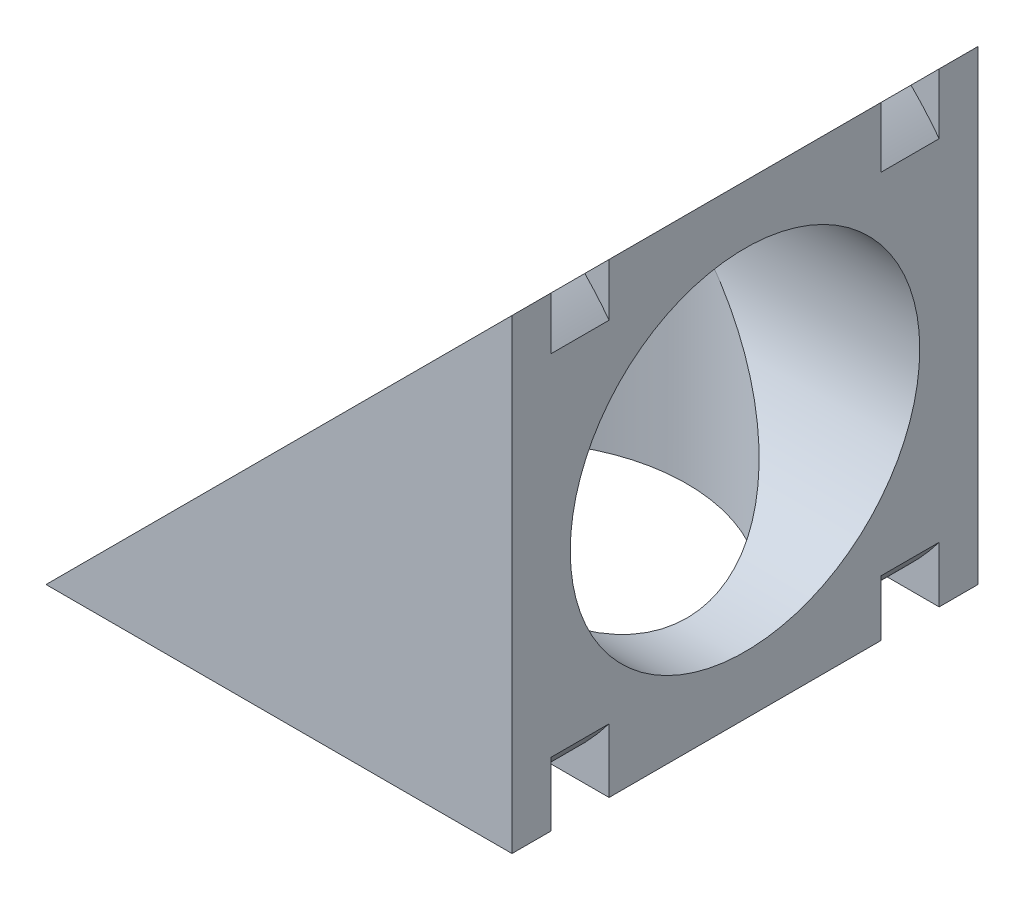
ISO-10303-21;
HEADER;
FILE_DESCRIPTION(('STEP AP214'),'2;1');
FILE_NAME('part.step','',(''),(''),'','','');
FILE_SCHEMA(('AUTOMOTIVE_DESIGN { 1 0 10303 214 1 1 1 1 }'));
ENDSEC;
DATA;
#1=APPLICATION_CONTEXT('core data for automotive mechanical design processes');
#2=APPLICATION_PROTOCOL_DEFINITION('international standard','automotive_design',2000,#1);
#3=PRODUCT_CONTEXT('',#1,'mechanical');
#4=PRODUCT('Part','Part','',(#3));
#5=PRODUCT_RELATED_PRODUCT_CATEGORY('part','',(#4));
#6=PRODUCT_DEFINITION_FORMATION('','',#4);
#7=PRODUCT_DEFINITION_CONTEXT('part definition',#1,'design');
#8=PRODUCT_DEFINITION('design','',#6,#7);
#9=PRODUCT_DEFINITION_SHAPE('','',#8);
#10=(LENGTH_UNIT() NAMED_UNIT(*) SI_UNIT(.MILLI.,.METRE.));
#11=(NAMED_UNIT(*) PLANE_ANGLE_UNIT() SI_UNIT($,.RADIAN.));
#12=(NAMED_UNIT(*) SI_UNIT($,.STERADIAN.) SOLID_ANGLE_UNIT());
#13=UNCERTAINTY_MEASURE_WITH_UNIT(LENGTH_MEASURE(1.E-05),#10,'distance_accuracy_value','');
#14=(GEOMETRIC_REPRESENTATION_CONTEXT(3) GLOBAL_UNCERTAINTY_ASSIGNED_CONTEXT((#13)) GLOBAL_UNIT_ASSIGNED_CONTEXT((#10,
#11,#12)) REPRESENTATION_CONTEXT('',''));
#15=CARTESIAN_POINT('',(0.,0.,0.));
#16=DIRECTION('',(0.,0.,1.));
#17=DIRECTION('',(1.,0.,0.));
#18=AXIS2_PLACEMENT_3D('',#15,#16,#17);
#19=CARTESIAN_POINT('',(0.,30.,0.));
#20=DIRECTION('',(0.,-1.,0.));
#21=DIRECTION('',(0.,0.,-1.));
#22=AXIS2_PLACEMENT_3D('',#19,#20,#21);
#23=CYLINDRICAL_SURFACE('',#22,9.);
#24=CARTESIAN_POINT('',(0.,0.,0.));
#25=DIRECTION('',(0.,1.,0.));
#26=DIRECTION('',(0.,0.,1.));
#27=AXIS2_PLACEMENT_3D('',#24,#25,#26);
#28=CIRCLE('',#27,9.);
#29=CARTESIAN_POINT('',(0.,0.,9.));
#30=VERTEX_POINT('',#29);
#31=EDGE_CURVE('E472',#30,#30,#28,.T.);
#32=ORIENTED_EDGE('',*,*,#31,.F.);
#33=EDGE_LOOP('',(#32));
#34=FACE_BOUND('',#33,.T.);
#35=CARTESIAN_POINT('',(0.,10.9393398282202,0.));
#36=DIRECTION('',(0.707106781186548,-0.707106781186548,0.));
#37=DIRECTION('',(-0.707106781186548,-0.707106781186548,0.));
#38=AXIS2_PLACEMENT_3D('',#35,#36,#37);
#39=ELLIPSE('',#38,12.7279220613579,9.);
#40=CARTESIAN_POINT('',(-6.22253967444163,4.71680015377856,6.50230728280353));
#41=VERTEX_POINT('',#40);
#42=CARTESIAN_POINT('',(0.530330085889903,11.4696699141101,8.9843614130332));
#43=VERTEX_POINT('',#42);
#44=EDGE_CURVE('E43',#41,#43,#39,.F.);
#45=ORIENTED_EDGE('',*,*,#44,.T.);
#46=CARTESIAN_POINT('',(0.,12.,0.));
#47=DIRECTION('',(-0.707106781186547,-0.707106781186547,0.));
#48=DIRECTION('',(0.707106781186547,-0.707106781186547,0.));
#49=AXIS2_PLACEMENT_3D('',#46,#47,#48);
#50=ELLIPSE('',#49,12.7279220613579,9.);
#51=CARTESIAN_POINT('',(0.530330085889778,11.46966991411,-8.98436141303321));
#52=VERTEX_POINT('',#51);
#53=EDGE_CURVE('E11',#43,#52,#50,.F.);
#54=ORIENTED_EDGE('',*,*,#53,.T.);
#55=CARTESIAN_POINT('',(-6.22253967444163,4.71680015377856,-6.50230728280353));
#56=VERTEX_POINT('',#55);
#57=EDGE_CURVE('E334',#52,#56,#39,.F.);
#58=ORIENTED_EDGE('',*,*,#57,.T.);
#59=CARTESIAN_POINT('',(0.,-1.50573952066307,0.));
#60=DIRECTION('',(-0.707106781186547,-0.707106781186547,0.));
#61=DIRECTION('',(0.707106781186548,-0.707106781186548,0.));
#62=AXIS2_PLACEMENT_3D('',#59,#60,#61);
#63=ELLIPSE('',#62,12.7279220613579,9.);
#64=CARTESIAN_POINT('',(-6.75286976033154,5.24713023966847,-5.94968486560421));
#65=VERTEX_POINT('',#64);
#66=EDGE_CURVE('E470',#56,#65,#63,.F.);
#67=ORIENTED_EDGE('',*,*,#66,.T.);
#68=CARTESIAN_POINT('',(0.,12.,0.));
#69=DIRECTION('',(-0.707106781186547,0.707106781186548,0.));
#70=DIRECTION('',(-0.707106781186548,-0.707106781186547,0.));
#71=AXIS2_PLACEMENT_3D('',#68,#69,#70);
#72=ELLIPSE('',#71,12.7279220613579,9.);
#73=CARTESIAN_POINT('',(-6.75286976033154,5.24713023966847,5.94968486560421));
#74=VERTEX_POINT('',#73);
#75=EDGE_CURVE('E244',#74,#65,#72,.F.);
#76=ORIENTED_EDGE('',*,*,#75,.F.);
#77=EDGE_CURVE('E243',#74,#41,#63,.F.);
#78=ORIENTED_EDGE('',*,*,#77,.T.);
#79=EDGE_LOOP('',(#45,#54,#58,#67,#76,#78));
#80=FACE_BOUND('',#79,.T.);
#81=ADVANCED_FACE('F35',(#34,#80),#23,.F.);
#82=CARTESIAN_POINT('',(-6.22253967444163,4.71680015377856,-9.55000000000001));
#83=DIRECTION('',(-0.707106781186547,-0.707106781186547,0.));
#84=DIRECTION('',(0.707106781186548,-0.707106781186548,0.));
#85=AXIS2_PLACEMENT_3D('',#82,#83,#84);
#86=PLANE('',#85);
#87=ORIENTED_EDGE('',*,*,#66,.F.);
#88=DIRECTION('',(0.,0.,1.));
#89=VECTOR('',#88,1.);
#90=CARTESIAN_POINT('',(-6.22253967444163,4.71680015377856,-9.55000000000001));
#91=LINE('',#90,#89);
#92=CARTESIAN_POINT('',(-6.22253967444163,4.71680015377856,-9.55000000000001));
#93=VERTEX_POINT('',#92);
#94=EDGE_CURVE('E412',#93,#56,#91,.T.);
#95=ORIENTED_EDGE('',*,*,#94,.F.);
#96=DIRECTION('',(-0.707106781186547,0.707106781186547,0.));
#97=VECTOR('',#96,1.);
#98=CARTESIAN_POINT('',(-6.22253967444163,4.71680015377856,-9.55000000000001));
#99=LINE('',#98,#97);
#100=CARTESIAN_POINT('',(-6.75286976033154,5.24713023966847,-9.55000000000001));
#101=VERTEX_POINT('',#100);
#102=EDGE_CURVE('E270',#93,#101,#99,.T.);
#103=ORIENTED_EDGE('',*,*,#102,.T.);
#104=DIRECTION('',(0.,0.,1.));
#105=VECTOR('',#104,1.);
#106=CARTESIAN_POINT('',(-6.75286976033154,5.24713023966847,-9.55000000000001));
#107=LINE('',#106,#105);
#108=EDGE_CURVE('E264',#101,#65,#107,.T.);
#109=ORIENTED_EDGE('',*,*,#108,.T.);
#110=EDGE_LOOP('',(#87,#95,#103,#109));
#111=FACE_BOUND('',#110,.T.);
#112=ADVANCED_FACE('F487',(#111),#86,.F.);
#113=CARTESIAN_POINT('',(7.28319984622143,18.2225396744416,-9.55000000000001));
#114=DIRECTION('',(0.707106781186547,0.707106781186547,0.));
#115=DIRECTION('',(-0.707106781186548,0.707106781186548,0.));
#116=AXIS2_PLACEMENT_3D('',#113,#114,#115);
#117=PLANE('',#116);
#118=CARTESIAN_POINT('',(13.505739520663,12.,0.));
#119=DIRECTION('',(0.707106781186547,0.707106781186547,0.));
#120=DIRECTION('',(-0.707106781186548,0.707106781186548,0.));
#121=AXIS2_PLACEMENT_3D('',#118,#119,#120);
#122=ELLIPSE('',#121,12.7279220613579,9.);
#123=CARTESIAN_POINT('',(7.28319984622143,18.2225396744416,6.50230728280353));
#124=VERTEX_POINT('',#123);
#125=CARTESIAN_POINT('',(6.75286976033152,18.7528697603315,5.94968486560423));
#126=VERTEX_POINT('',#125);
#127=EDGE_CURVE('E238',#124,#126,#122,.F.);
#128=ORIENTED_EDGE('',*,*,#127,.F.);
#129=DIRECTION('',(0.,0.,-1.));
#130=VECTOR('',#129,1.);
#131=CARTESIAN_POINT('',(7.28319984622143,18.2225396744416,-9.55000000000001));
#132=LINE('',#131,#130);
#133=CARTESIAN_POINT('',(7.28319984622143,18.2225396744416,9.54999999999999));
#134=VERTEX_POINT('',#133);
#135=EDGE_CURVE('E418',#134,#124,#132,.T.);
#136=ORIENTED_EDGE('',*,*,#135,.F.);
#137=DIRECTION('',(-0.707106781186547,0.707106781186547,0.));
#138=VECTOR('',#137,1.);
#139=CARTESIAN_POINT('',(7.28319984622143,18.2225396744416,9.54999999999999));
#140=LINE('',#139,#138);
#141=CARTESIAN_POINT('',(6.75286976033152,18.7528697603315,9.54999999999999));
#142=VERTEX_POINT('',#141);
#143=EDGE_CURVE('E275',#134,#142,#140,.T.);
#144=ORIENTED_EDGE('',*,*,#143,.T.);
#145=DIRECTION('',(0.,0.,-1.));
#146=VECTOR('',#145,1.);
#147=CARTESIAN_POINT('',(6.75286976033152,18.7528697603315,-9.55000000000001));
#148=LINE('',#147,#146);
#149=EDGE_CURVE('E260',#142,#126,#148,.T.);
#150=ORIENTED_EDGE('',*,*,#149,.T.);
#151=EDGE_LOOP('',(#128,#136,#144,#150));
#152=FACE_BOUND('',#151,.T.);
#153=ADVANCED_FACE('F498',(#152),#117,.F.);
#154=CARTESIAN_POINT('',(-5.46966991411009,5.46966991411009,0.));
#155=DIRECTION('',(0.707106781186548,-0.707106781186548,0.));
#156=DIRECTION('',(0.707106781186548,0.707106781186548,0.));
#157=AXIS2_PLACEMENT_3D('',#154,#155,#156);
#158=PLANE('',#157);
#159=CARTESIAN_POINT('',(1.0606601717798,12.,0.));
#160=DIRECTION('',(0.707106781186548,-0.707106781186548,0.));
#161=DIRECTION('',(-0.707106781186548,-0.707106781186548,0.));
#162=AXIS2_PLACEMENT_3D('',#159,#160,#161);
#163=ELLIPSE('',#162,12.7279220613579,9.);
#164=EDGE_CURVE('E479',#43,#124,#163,.F.);
#165=ORIENTED_EDGE('',*,*,#164,.F.);
#166=ORIENTED_EDGE('',*,*,#44,.F.);
#167=CARTESIAN_POINT('',(-6.22253967444163,4.71680015377856,9.54999999999999));
#168=VERTEX_POINT('',#167);
#169=EDGE_CURVE('E269',#41,#168,#91,.T.);
#170=ORIENTED_EDGE('',*,*,#169,.T.);
#171=DIRECTION('',(0.707106781186548,0.707106781186548,0.));
#172=VECTOR('',#171,1.);
#173=CARTESIAN_POINT('',(7.28319984622143,18.2225396744416,9.54999999999999));
#174=LINE('',#173,#172);
#175=EDGE_CURVE('E415',#168,#134,#174,.T.);
#176=ORIENTED_EDGE('',*,*,#175,.T.);
#177=ORIENTED_EDGE('',*,*,#135,.T.);
#178=EDGE_LOOP('',(#165,#166,#170,#176,#177));
#179=FACE_BOUND('',#178,.T.);
#180=ADVANCED_FACE('F496',(#179),#158,.F.);
#181=CARTESIAN_POINT('',(12.,24.,-12.));
#182=DIRECTION('',(-1.,0.,0.));
#183=DIRECTION('',(0.,0.,1.));
#184=AXIS2_PLACEMENT_3D('',#181,#182,#183);
#185=PLANE('',#184);
#186=CARTESIAN_POINT('',(12.,12.,0.));
#187=DIRECTION('',(-1.,0.,0.));
#188=DIRECTION('',(0.,0.,1.));
#189=AXIS2_PLACEMENT_3D('',#186,#187,#188);
#190=CIRCLE('',#189,9.);
#191=CARTESIAN_POINT('',(12.,12.,8.99999999999999));
#192=VERTEX_POINT('',#191);
#193=EDGE_CURVE('E475',#192,#192,#190,.F.);
#194=ORIENTED_EDGE('',*,*,#193,.F.);
#195=EDGE_LOOP('',(#194));
#196=FACE_BOUND('',#195,.T.);
#197=DIRECTION('',(0.,0.,-1.));
#198=VECTOR('',#197,1.);
#199=CARTESIAN_POINT('',(12.,20.8850102409347,-7.));
#200=LINE('',#199,#198);
#201=CARTESIAN_POINT('',(12.,20.8850102409347,-10.));
#202=VERTEX_POINT('',#201);
#203=CARTESIAN_POINT('',(12.,20.8850102409347,-7.));
#204=VERTEX_POINT('',#203);
#205=EDGE_CURVE('E361',#202,#204,#200,.F.);
#206=ORIENTED_EDGE('',*,*,#205,.T.);
#207=DIRECTION('',(0.,1.,0.));
#208=VECTOR('',#207,1.);
#209=CARTESIAN_POINT('',(12.,24.,-7.));
#210=LINE('',#209,#208);
#211=CARTESIAN_POINT('',(12.,24.,-7.));
#212=VERTEX_POINT('',#211);
#213=EDGE_CURVE('E360',#204,#212,#210,.T.);
#214=ORIENTED_EDGE('',*,*,#213,.T.);
#215=DIRECTION('',(0.,0.,-1.));
#216=VECTOR('',#215,1.);
#217=CARTESIAN_POINT('',(12.,24.,-12.));
#218=LINE('',#217,#216);
#219=CARTESIAN_POINT('',(12.,24.,7.));
#220=VERTEX_POINT('',#219);
#221=EDGE_CURVE('E289',#220,#212,#218,.T.);
#222=ORIENTED_EDGE('',*,*,#221,.F.);
#223=DIRECTION('',(0.,1.,0.));
#224=VECTOR('',#223,1.);
#225=CARTESIAN_POINT('',(12.,24.,7.));
#226=LINE('',#225,#224);
#227=CARTESIAN_POINT('',(12.,21.2889293337778,7.));
#228=VERTEX_POINT('',#227);
#229=EDGE_CURVE('E359',#228,#220,#226,.T.);
#230=ORIENTED_EDGE('',*,*,#229,.F.);
#231=DIRECTION('',(0.,0.,1.));
#232=VECTOR('',#231,1.);
#233=CARTESIAN_POINT('',(12.,21.2889293337778,7.));
#234=LINE('',#233,#232);
#235=CARTESIAN_POINT('',(12.,21.2889293337778,10.));
#236=VERTEX_POINT('',#235);
#237=EDGE_CURVE('E395',#236,#228,#234,.F.);
#238=ORIENTED_EDGE('',*,*,#237,.F.);
#239=DIRECTION('',(0.,1.,0.));
#240=VECTOR('',#239,1.);
#241=CARTESIAN_POINT('',(12.,24.,10.));
#242=LINE('',#241,#240);
#243=CARTESIAN_POINT('',(12.,24.,10.));
#244=VERTEX_POINT('',#243);
#245=EDGE_CURVE('E399',#236,#244,#242,.T.);
#246=ORIENTED_EDGE('',*,*,#245,.T.);
#247=CARTESIAN_POINT('',(12.,24.,12.));
#248=VERTEX_POINT('',#247);
#249=EDGE_CURVE('E285',#248,#244,#218,.T.);
#250=ORIENTED_EDGE('',*,*,#249,.F.);
#251=DIRECTION('',(0.,-1.,0.));
#252=VECTOR('',#251,1.);
#253=CARTESIAN_POINT('',(12.,24.,12.));
#254=LINE('',#253,#252);
#255=CARTESIAN_POINT('',(12.,0.,12.));
#256=VERTEX_POINT('',#255);
#257=EDGE_CURVE('E288',#248,#256,#254,.T.);
#258=ORIENTED_EDGE('',*,*,#257,.T.);
#259=DIRECTION('',(0.,0.,-1.));
#260=VECTOR('',#259,1.);
#261=CARTESIAN_POINT('',(12.,0.,-12.));
#262=LINE('',#261,#260);
#263=CARTESIAN_POINT('',(12.,0.,10.));
#264=VERTEX_POINT('',#263);
#265=EDGE_CURVE('E291',#256,#264,#262,.T.);
#266=ORIENTED_EDGE('',*,*,#265,.T.);
#267=CARTESIAN_POINT('',(12.,3.28892933377779,10.));
#268=VERTEX_POINT('',#267);
#269=EDGE_CURVE('E403',#264,#268,#242,.T.);
#270=ORIENTED_EDGE('',*,*,#269,.T.);
#271=DIRECTION('',(0.,0.,1.));
#272=VECTOR('',#271,1.);
#273=CARTESIAN_POINT('',(12.,3.28892933377779,7.));
#274=LINE('',#273,#272);
#275=CARTESIAN_POINT('',(12.,3.28892933377779,7.));
#276=VERTEX_POINT('',#275);
#277=EDGE_CURVE('E397',#276,#268,#274,.T.);
#278=ORIENTED_EDGE('',*,*,#277,.F.);
#279=CARTESIAN_POINT('',(12.,0.,7.));
#280=VERTEX_POINT('',#279);
#281=EDGE_CURVE('E409',#280,#276,#226,.T.);
#282=ORIENTED_EDGE('',*,*,#281,.F.);
#283=CARTESIAN_POINT('',(12.,0.,-7.));
#284=VERTEX_POINT('',#283);
#285=EDGE_CURVE('E295',#280,#284,#262,.T.);
#286=ORIENTED_EDGE('',*,*,#285,.T.);
#287=CARTESIAN_POINT('',(12.,2.88501024093469,-7.));
#288=VERTEX_POINT('',#287);
#289=EDGE_CURVE('E366',#284,#288,#210,.T.);
#290=ORIENTED_EDGE('',*,*,#289,.T.);
#291=DIRECTION('',(0.,0.,-1.));
#292=VECTOR('',#291,1.);
#293=CARTESIAN_POINT('',(12.,2.88501024093469,-7.));
#294=LINE('',#293,#292);
#295=CARTESIAN_POINT('',(12.,2.88501024093469,-10.));
#296=VERTEX_POINT('',#295);
#297=EDGE_CURVE('E459',#288,#296,#294,.T.);
#298=ORIENTED_EDGE('',*,*,#297,.T.);
#299=DIRECTION('',(0.,1.,0.));
#300=VECTOR('',#299,1.);
#301=CARTESIAN_POINT('',(12.,24.,-10.));
#302=LINE('',#301,#300);
#303=CARTESIAN_POINT('',(12.,0.,-10.));
#304=VERTEX_POINT('',#303);
#305=EDGE_CURVE('E364',#304,#296,#302,.T.);
#306=ORIENTED_EDGE('',*,*,#305,.F.);
#307=CARTESIAN_POINT('',(12.,0.,-12.));
#308=VERTEX_POINT('',#307);
#309=EDGE_CURVE('E284',#304,#308,#262,.T.);
#310=ORIENTED_EDGE('',*,*,#309,.T.);
#311=DIRECTION('',(0.,-1.,0.));
#312=VECTOR('',#311,1.);
#313=CARTESIAN_POINT('',(12.,24.,-12.));
#314=LINE('',#313,#312);
#315=CARTESIAN_POINT('',(12.,24.,-12.));
#316=VERTEX_POINT('',#315);
#317=EDGE_CURVE('E307',#316,#308,#314,.T.);
#318=ORIENTED_EDGE('',*,*,#317,.F.);
#319=CARTESIAN_POINT('',(12.,24.,-10.));
#320=VERTEX_POINT('',#319);
#321=EDGE_CURVE('E290',#320,#316,#218,.T.);
#322=ORIENTED_EDGE('',*,*,#321,.F.);
#323=EDGE_CURVE('E353',#202,#320,#302,.T.);
#324=ORIENTED_EDGE('',*,*,#323,.F.);
#325=EDGE_LOOP('',(#206,#214,#222,#230,#238,#246,#250,#258,#266,#270,#278,#282,#286,#290,#298,
#306,#310,#318,#322,#324));
#326=FACE_BOUND('',#325,.T.);
#327=ADVANCED_FACE('F37',(#196,#326),#185,.F.);
#328=CARTESIAN_POINT('',(0.,0.,0.));
#329=DIRECTION('',(0.,1.,0.));
#330=DIRECTION('',(0.,0.,1.));
#331=AXIS2_PLACEMENT_3D('',#328,#329,#330);
#332=PLANE('',#331);
#333=ORIENTED_EDGE('',*,*,#31,.T.);
#334=EDGE_LOOP('',(#333));
#335=FACE_BOUND('',#334,.T.);
#336=DIRECTION('',(0.,0.,-1.));
#337=VECTOR('',#336,1.);
#338=CARTESIAN_POINT('',(9.15131310648245,0.,-7.));
#339=LINE('',#338,#337);
#340=CARTESIAN_POINT('',(9.15131310648245,0.,-10.));
#341=VERTEX_POINT('',#340);
#342=CARTESIAN_POINT('',(9.15131310648245,0.,-7.));
#343=VERTEX_POINT('',#342);
#344=EDGE_CURVE('E461',#341,#343,#339,.F.);
#345=ORIENTED_EDGE('',*,*,#344,.T.);
#346=DIRECTION('',(1.,0.,0.));
#347=VECTOR('',#346,1.);
#348=CARTESIAN_POINT('',(0.,0.,-7.));
#349=LINE('',#348,#347);
#350=EDGE_CURVE('E368',#343,#284,#349,.T.);
#351=ORIENTED_EDGE('',*,*,#350,.T.);
#352=ORIENTED_EDGE('',*,*,#285,.F.);
#353=DIRECTION('',(1.,0.,0.));
#354=VECTOR('',#353,1.);
#355=CARTESIAN_POINT('',(0.,0.,7.));
#356=LINE('',#355,#354);
#357=CARTESIAN_POINT('',(8.601291521011,0.,7.));
#358=VERTEX_POINT('',#357);
#359=EDGE_CURVE('E411',#358,#280,#356,.T.);
#360=ORIENTED_EDGE('',*,*,#359,.F.);
#361=DIRECTION('',(0.,0.,1.));
#362=VECTOR('',#361,1.);
#363=CARTESIAN_POINT('',(8.601291521011,0.,7.));
#364=LINE('',#363,#362);
#365=CARTESIAN_POINT('',(8.601291521011,0.,10.));
#366=VERTEX_POINT('',#365);
#367=EDGE_CURVE('E387',#366,#358,#364,.F.);
#368=ORIENTED_EDGE('',*,*,#367,.F.);
#369=DIRECTION('',(1.,0.,0.));
#370=VECTOR('',#369,1.);
#371=CARTESIAN_POINT('',(0.,0.,10.));
#372=LINE('',#371,#370);
#373=EDGE_CURVE('E406',#366,#264,#372,.T.);
#374=ORIENTED_EDGE('',*,*,#373,.T.);
#375=ORIENTED_EDGE('',*,*,#265,.F.);
#376=DIRECTION('',(1.,0.,0.));
#377=VECTOR('',#376,1.);
#378=CARTESIAN_POINT('',(-12.,0.,12.));
#379=LINE('',#378,#377);
#380=CARTESIAN_POINT('',(-12.,0.,12.));
#381=VERTEX_POINT('',#380);
#382=EDGE_CURVE('E302',#381,#256,#379,.T.);
#383=ORIENTED_EDGE('',*,*,#382,.F.);
#384=DIRECTION('',(0.,0.,1.));
#385=VECTOR('',#384,1.);
#386=CARTESIAN_POINT('',(-12.,0.,-12.));
#387=LINE('',#386,#385);
#388=CARTESIAN_POINT('',(-12.,0.,10.));
#389=VERTEX_POINT('',#388);
#390=EDGE_CURVE('E298',#389,#381,#387,.T.);
#391=ORIENTED_EDGE('',*,*,#390,.F.);
#392=CARTESIAN_POINT('',(-8.601291521011,0.,10.));
#393=VERTEX_POINT('',#392);
#394=EDGE_CURVE('E402',#389,#393,#372,.T.);
#395=ORIENTED_EDGE('',*,*,#394,.T.);
#396=DIRECTION('',(0.,0.,1.));
#397=VECTOR('',#396,1.);
#398=CARTESIAN_POINT('',(-8.601291521011,0.,7.));
#399=LINE('',#398,#397);
#400=CARTESIAN_POINT('',(-8.601291521011,0.,7.));
#401=VERTEX_POINT('',#400);
#402=EDGE_CURVE('E393',#401,#393,#399,.T.);
#403=ORIENTED_EDGE('',*,*,#402,.F.);
#404=CARTESIAN_POINT('',(-12.,0.,7.));
#405=VERTEX_POINT('',#404);
#406=EDGE_CURVE('E408',#405,#401,#356,.T.);
#407=ORIENTED_EDGE('',*,*,#406,.F.);
#408=CARTESIAN_POINT('',(-12.,0.,-7.));
#409=VERTEX_POINT('',#408);
#410=EDGE_CURVE('E303',#409,#405,#387,.T.);
#411=ORIENTED_EDGE('',*,*,#410,.F.);
#412=CARTESIAN_POINT('',(-9.15131310648245,0.,-7.));
#413=VERTEX_POINT('',#412);
#414=EDGE_CURVE('E363',#409,#413,#349,.T.);
#415=ORIENTED_EDGE('',*,*,#414,.T.);
#416=DIRECTION('',(0.,0.,-1.));
#417=VECTOR('',#416,1.);
#418=CARTESIAN_POINT('',(-9.15131310648245,0.,-7.));
#419=LINE('',#418,#417);
#420=CARTESIAN_POINT('',(-9.15131310648245,0.,-10.));
#421=VERTEX_POINT('',#420);
#422=EDGE_CURVE('E456',#413,#421,#419,.T.);
#423=ORIENTED_EDGE('',*,*,#422,.T.);
#424=DIRECTION('',(1.,0.,0.));
#425=VECTOR('',#424,1.);
#426=CARTESIAN_POINT('',(0.,0.,-10.));
#427=LINE('',#426,#425);
#428=CARTESIAN_POINT('',(-12.,0.,-10.));
#429=VERTEX_POINT('',#428);
#430=EDGE_CURVE('E452',#429,#421,#427,.T.);
#431=ORIENTED_EDGE('',*,*,#430,.F.);
#432=CARTESIAN_POINT('',(-12.,0.,-12.));
#433=VERTEX_POINT('',#432);
#434=EDGE_CURVE('E299',#433,#429,#387,.T.);
#435=ORIENTED_EDGE('',*,*,#434,.F.);
#436=DIRECTION('',(-1.,0.,0.));
#437=VECTOR('',#436,1.);
#438=CARTESIAN_POINT('',(-12.,0.,-12.));
#439=LINE('',#438,#437);
#440=EDGE_CURVE('E294',#308,#433,#439,.T.);
#441=ORIENTED_EDGE('',*,*,#440,.F.);
#442=ORIENTED_EDGE('',*,*,#309,.F.);
#443=EDGE_CURVE('E370',#341,#304,#427,.T.);
#444=ORIENTED_EDGE('',*,*,#443,.F.);
#445=EDGE_LOOP('',(#345,#351,#352,#360,#368,#374,#375,#383,#391,#395,#403,#407,#411,#415,#423,
#431,#435,#441,#442,#444));
#446=FACE_BOUND('',#445,.T.);
#447=ADVANCED_FACE('F438',(#335,#446),#332,.F.);
#448=CARTESIAN_POINT('',(-6.,6.,0.));
#449=DIRECTION('',(-0.707106781186547,0.707106781186548,0.));
#450=DIRECTION('',(-0.707106781186548,-0.707106781186547,0.));
#451=AXIS2_PLACEMENT_3D('',#448,#449,#450);
#452=PLANE('',#451);
#453=DIRECTION('',(0.707106781186548,0.707106781186547,0.));
#454=VECTOR('',#453,1.);
#455=CARTESIAN_POINT('',(-6.,6.,-7.));
#456=LINE('',#455,#454);
#457=CARTESIAN_POINT('',(10.5489510067587,22.5489510067587,-7.));
#458=VERTEX_POINT('',#457);
#459=EDGE_CURVE('E333',#458,#212,#456,.T.);
#460=ORIENTED_EDGE('',*,*,#459,.F.);
#461=DIRECTION('',(0.,0.,-1.));
#462=VECTOR('',#461,1.);
#463=CARTESIAN_POINT('',(10.5489510067587,22.5489510067587,-7.));
#464=LINE('',#463,#462);
#465=CARTESIAN_POINT('',(10.5489510067587,22.5489510067587,-10.));
#466=VERTEX_POINT('',#465);
#467=EDGE_CURVE('E332',#466,#458,#464,.F.);
#468=ORIENTED_EDGE('',*,*,#467,.F.);
#469=DIRECTION('',(0.707106781186548,0.707106781186547,0.));
#470=VECTOR('',#469,1.);
#471=CARTESIAN_POINT('',(-6.,6.,-10.));
#472=LINE('',#471,#470);
#473=EDGE_CURVE('E329',#466,#320,#472,.T.);
#474=ORIENTED_EDGE('',*,*,#473,.T.);
#475=ORIENTED_EDGE('',*,*,#321,.T.);
#476=DIRECTION('',(-0.707106781186548,-0.707106781186547,0.));
#477=VECTOR('',#476,1.);
#478=CARTESIAN_POINT('',(0.,12.,-12.));
#479=LINE('',#478,#477);
#480=EDGE_CURVE('E282',#316,#433,#479,.T.);
#481=ORIENTED_EDGE('',*,*,#480,.T.);
#482=ORIENTED_EDGE('',*,*,#434,.T.);
#483=CARTESIAN_POINT('',(-10.663940765824,1.33605923417596,-10.));
#484=VERTEX_POINT('',#483);
#485=EDGE_CURVE('E325',#429,#484,#472,.T.);
#486=ORIENTED_EDGE('',*,*,#485,.T.);
#487=DIRECTION('',(0.,0.,-1.));
#488=VECTOR('',#487,1.);
#489=CARTESIAN_POINT('',(-10.663940765824,1.33605923417596,-7.));
#490=LINE('',#489,#488);
#491=CARTESIAN_POINT('',(-10.663940765824,1.33605923417596,-7.));
#492=VERTEX_POINT('',#491);
#493=EDGE_CURVE('E323',#492,#484,#490,.T.);
#494=ORIENTED_EDGE('',*,*,#493,.F.);
#495=EDGE_CURVE('E328',#409,#492,#456,.T.);
#496=ORIENTED_EDGE('',*,*,#495,.F.);
#497=ORIENTED_EDGE('',*,*,#410,.T.);
#498=DIRECTION('',(0.707106781186548,0.707106781186547,0.));
#499=VECTOR('',#498,1.);
#500=CARTESIAN_POINT('',(-6.,6.,7.));
#501=LINE('',#500,#499);
#502=CARTESIAN_POINT('',(-10.4611531821579,1.53884681784207,7.));
#503=VERTEX_POINT('',#502);
#504=EDGE_CURVE('E320',#405,#503,#501,.T.);
#505=ORIENTED_EDGE('',*,*,#504,.T.);
#506=DIRECTION('',(0.,0.,1.));
#507=VECTOR('',#506,1.);
#508=CARTESIAN_POINT('',(-10.4611531821579,1.53884681784207,7.));
#509=LINE('',#508,#507);
#510=CARTESIAN_POINT('',(-10.4611531821579,1.53884681784207,10.));
#511=VERTEX_POINT('',#510);
#512=EDGE_CURVE('E319',#503,#511,#509,.T.);
#513=ORIENTED_EDGE('',*,*,#512,.T.);
#514=DIRECTION('',(0.707106781186548,0.707106781186547,0.));
#515=VECTOR('',#514,1.);
#516=CARTESIAN_POINT('',(-6.,6.,10.));
#517=LINE('',#516,#515);
#518=EDGE_CURVE('E316',#389,#511,#517,.T.);
#519=ORIENTED_EDGE('',*,*,#518,.F.);
#520=ORIENTED_EDGE('',*,*,#390,.T.);
#521=DIRECTION('',(0.707106781186548,0.707106781186547,0.));
#522=VECTOR('',#521,1.);
#523=CARTESIAN_POINT('',(0.,12.,12.));
#524=LINE('',#523,#522);
#525=EDGE_CURVE('E272',#381,#248,#524,.T.);
#526=ORIENTED_EDGE('',*,*,#525,.T.);
#527=ORIENTED_EDGE('',*,*,#249,.T.);
#528=CARTESIAN_POINT('',(10.7500825159357,22.7500825159357,10.));
#529=VERTEX_POINT('',#528);
#530=EDGE_CURVE('E313',#529,#244,#517,.T.);
#531=ORIENTED_EDGE('',*,*,#530,.F.);
#532=DIRECTION('',(0.,0.,1.));
#533=VECTOR('',#532,1.);
#534=CARTESIAN_POINT('',(10.7500825159357,22.7500825159357,7.));
#535=LINE('',#534,#533);
#536=CARTESIAN_POINT('',(10.7500825159357,22.7500825159357,7.));
#537=VERTEX_POINT('',#536);
#538=EDGE_CURVE('E310',#529,#537,#535,.F.);
#539=ORIENTED_EDGE('',*,*,#538,.T.);
#540=EDGE_CURVE('E315',#537,#220,#501,.T.);
#541=ORIENTED_EDGE('',*,*,#540,.T.);
#542=ORIENTED_EDGE('',*,*,#221,.T.);
#543=EDGE_LOOP('',(#460,#468,#474,#475,#481,#482,#486,#494,#496,#497,#505,#513,#519,#520,#526,
#527,#531,#539,#541,#542));
#544=FACE_BOUND('',#543,.T.);
#545=CARTESIAN_POINT('',(6.75286976033152,18.7528697603315,-5.94968486560424));
#546=VERTEX_POINT('',#545);
#547=CARTESIAN_POINT('',(6.75286976033152,18.7528697603315,-9.55000000000001));
#548=VERTEX_POINT('',#547);
#549=EDGE_CURVE('E250',#546,#548,#148,.T.);
#550=ORIENTED_EDGE('',*,*,#549,.F.);
#551=EDGE_CURVE('E231',#546,#126,#72,.F.);
#552=ORIENTED_EDGE('',*,*,#551,.T.);
#553=ORIENTED_EDGE('',*,*,#149,.F.);
#554=DIRECTION('',(0.707106781186548,0.707106781186548,0.));
#555=VECTOR('',#554,1.);
#556=CARTESIAN_POINT('',(6.75286976033152,18.7528697603315,9.54999999999999));
#557=LINE('',#556,#555);
#558=CARTESIAN_POINT('',(-6.75286976033154,5.24713023966847,9.54999999999999));
#559=VERTEX_POINT('',#558);
#560=EDGE_CURVE('E261',#559,#142,#557,.T.);
#561=ORIENTED_EDGE('',*,*,#560,.F.);
#562=EDGE_CURVE('E423',#74,#559,#107,.T.);
#563=ORIENTED_EDGE('',*,*,#562,.F.);
#564=ORIENTED_EDGE('',*,*,#75,.T.);
#565=ORIENTED_EDGE('',*,*,#108,.F.);
#566=DIRECTION('',(-0.707106781186547,-0.707106781186547,0.));
#567=VECTOR('',#566,1.);
#568=CARTESIAN_POINT('',(6.75286976033152,18.7528697603315,-9.55000000000001));
#569=LINE('',#568,#567);
#570=EDGE_CURVE('E259',#548,#101,#569,.T.);
#571=ORIENTED_EDGE('',*,*,#570,.F.);
#572=EDGE_LOOP('',(#550,#552,#553,#561,#563,#564,#565,#571));
#573=FACE_BOUND('',#572,.T.);
#574=ADVANCED_FACE('F256',(#544,#573),#452,.T.);
#575=CARTESIAN_POINT('',(-12.,24.,-12.));
#576=DIRECTION('',(0.,0.,1.));
#577=DIRECTION('',(1.,0.,0.));
#578=AXIS2_PLACEMENT_3D('',#575,#576,#577);
#579=PLANE('',#578);
#580=ORIENTED_EDGE('',*,*,#480,.F.);
#581=ORIENTED_EDGE('',*,*,#317,.T.);
#582=ORIENTED_EDGE('',*,*,#440,.T.);
#583=EDGE_LOOP('',(#580,#581,#582));
#584=FACE_BOUND('',#583,.T.);
#585=ADVANCED_FACE('F446',(#584),#579,.F.);
#586=CARTESIAN_POINT('',(-12.,24.,12.));
#587=DIRECTION('',(0.,0.,-1.));
#588=DIRECTION('',(-1.,0.,0.));
#589=AXIS2_PLACEMENT_3D('',#586,#587,#588);
#590=PLANE('',#589);
#591=ORIENTED_EDGE('',*,*,#525,.F.);
#592=ORIENTED_EDGE('',*,*,#382,.T.);
#593=ORIENTED_EDGE('',*,*,#257,.F.);
#594=EDGE_LOOP('',(#591,#592,#593));
#595=FACE_BOUND('',#594,.T.);
#596=ADVANCED_FACE('F556',(#595),#590,.F.);
#597=ORIENTED_EDGE('',*,*,#77,.F.);
#598=ORIENTED_EDGE('',*,*,#562,.T.);
#599=DIRECTION('',(-0.707106781186547,0.707106781186547,0.));
#600=VECTOR('',#599,1.);
#601=CARTESIAN_POINT('',(-6.22253967444163,4.71680015377856,9.54999999999999));
#602=LINE('',#601,#600);
#603=EDGE_CURVE('E277',#168,#559,#602,.T.);
#604=ORIENTED_EDGE('',*,*,#603,.F.);
#605=ORIENTED_EDGE('',*,*,#169,.F.);
#606=EDGE_LOOP('',(#597,#598,#604,#605));
#607=FACE_BOUND('',#606,.T.);
#608=ADVANCED_FACE('F494',(#607),#86,.F.);
#609=CARTESIAN_POINT('',(7.28319984622143,18.2225396744416,-9.55000000000001));
#610=DIRECTION('',(0.,0.,-1.));
#611=DIRECTION('',(-1.,0.,0.));
#612=AXIS2_PLACEMENT_3D('',#609,#610,#611);
#613=PLANE('',#612);
#614=ORIENTED_EDGE('',*,*,#570,.T.);
#615=ORIENTED_EDGE('',*,*,#102,.F.);
#616=DIRECTION('',(-0.707106781186547,-0.707106781186547,0.));
#617=VECTOR('',#616,1.);
#618=CARTESIAN_POINT('',(7.28319984622143,18.2225396744416,-9.55000000000001));
#619=LINE('',#618,#617);
#620=CARTESIAN_POINT('',(7.28319984622143,18.2225396744416,-9.55000000000001));
#621=VERTEX_POINT('',#620);
#622=EDGE_CURVE('E280',#621,#93,#619,.T.);
#623=ORIENTED_EDGE('',*,*,#622,.F.);
#624=DIRECTION('',(-0.707106781186547,0.707106781186547,0.));
#625=VECTOR('',#624,1.);
#626=CARTESIAN_POINT('',(7.28319984622143,18.2225396744416,-9.55000000000001));
#627=LINE('',#626,#625);
#628=EDGE_CURVE('E273',#621,#548,#627,.T.);
#629=ORIENTED_EDGE('',*,*,#628,.T.);
#630=EDGE_LOOP('',(#614,#615,#623,#629));
#631=FACE_BOUND('',#630,.T.);
#632=ADVANCED_FACE('F510',(#631),#613,.F.);
#633=CARTESIAN_POINT('',(13.505739520663,12.,0.));
#634=DIRECTION('',(0.707106781186547,0.707106781186547,0.));
#635=DIRECTION('',(-0.707106781186548,0.707106781186548,0.));
#636=AXIS2_PLACEMENT_3D('',#633,#634,#635);
#637=ELLIPSE('',#636,12.7279220613579,9.);
#638=CARTESIAN_POINT('',(7.28319984622143,18.2225396744416,-6.50230728280355));
#639=VERTEX_POINT('',#638);
#640=EDGE_CURVE('E235',#546,#639,#637,.F.);
#641=ORIENTED_EDGE('',*,*,#640,.F.);
#642=ORIENTED_EDGE('',*,*,#549,.T.);
#643=ORIENTED_EDGE('',*,*,#628,.F.);
#644=EDGE_CURVE('E252',#639,#621,#132,.T.);
#645=ORIENTED_EDGE('',*,*,#644,.F.);
#646=EDGE_LOOP('',(#641,#642,#643,#645));
#647=FACE_BOUND('',#646,.T.);
#648=ADVANCED_FACE('F248',(#647),#117,.F.);
#649=CARTESIAN_POINT('',(7.28319984622143,18.2225396744416,9.54999999999999));
#650=DIRECTION('',(0.,0.,1.));
#651=DIRECTION('',(1.,0.,0.));
#652=AXIS2_PLACEMENT_3D('',#649,#650,#651);
#653=PLANE('',#652);
#654=ORIENTED_EDGE('',*,*,#560,.T.);
#655=ORIENTED_EDGE('',*,*,#143,.F.);
#656=ORIENTED_EDGE('',*,*,#175,.F.);
#657=ORIENTED_EDGE('',*,*,#603,.T.);
#658=EDGE_LOOP('',(#654,#655,#656,#657));
#659=FACE_BOUND('',#658,.T.);
#660=ADVANCED_FACE('F490',(#659),#653,.F.);
#661=CARTESIAN_POINT('',(1.0606601717798,12.,0.));
#662=DIRECTION('',(0.707106781186548,-0.707106781186548,0.));
#663=DIRECTION('',(-0.707106781186548,-0.707106781186548,0.));
#664=AXIS2_PLACEMENT_3D('',#661,#662,#663);
#665=ELLIPSE('',#664,12.7279220613579,9.);
#666=EDGE_CURVE('E253',#639,#52,#665,.F.);
#667=ORIENTED_EDGE('',*,*,#666,.F.);
#668=ORIENTED_EDGE('',*,*,#644,.T.);
#669=ORIENTED_EDGE('',*,*,#622,.T.);
#670=ORIENTED_EDGE('',*,*,#94,.T.);
#671=ORIENTED_EDGE('',*,*,#57,.F.);
#672=EDGE_LOOP('',(#667,#668,#669,#670,#671));
#673=FACE_BOUND('',#672,.T.);
#674=ADVANCED_FACE('F484',(#673),#158,.F.);
#675=CARTESIAN_POINT('',(0.,12.2889293337778,7.));
#676=DIRECTION('',(0.,0.,1.));
#677=DIRECTION('',(1.,0.,0.));
#678=AXIS2_PLACEMENT_3D('',#675,#676,#677);
#679=CYLINDRICAL_SURFACE('',#678,15.);
#680=ORIENTED_EDGE('',*,*,#237,.T.);
#681=CARTESIAN_POINT('',(0.,12.2889293337778,7.));
#682=DIRECTION('',(0.,0.,1.));
#683=DIRECTION('',(1.,0.,0.));
#684=AXIS2_PLACEMENT_3D('',#681,#682,#683);
#685=CIRCLE('',#684,15.);
#686=EDGE_CURVE('E386',#228,#537,#685,.T.);
#687=ORIENTED_EDGE('',*,*,#686,.T.);
#688=ORIENTED_EDGE('',*,*,#538,.F.);
#689=CARTESIAN_POINT('',(0.,12.2889293337778,10.));
#690=DIRECTION('',(0.,0.,1.));
#691=DIRECTION('',(1.,0.,0.));
#692=AXIS2_PLACEMENT_3D('',#689,#690,#691);
#693=CIRCLE('',#692,15.);
#694=EDGE_CURVE('E380',#236,#529,#693,.T.);
#695=ORIENTED_EDGE('',*,*,#694,.F.);
#696=EDGE_LOOP('',(#680,#687,#688,#695));
#697=FACE_BOUND('',#696,.T.);
#698=ADVANCED_FACE('F540',(#697),#679,.T.);
#699=CARTESIAN_POINT('',(0.,12.2889293337778,10.));
#700=DIRECTION('',(0.,0.,1.));
#701=DIRECTION('',(1.,0.,0.));
#702=AXIS2_PLACEMENT_3D('',#699,#700,#701);
#703=PLANE('',#702);
#704=ORIENTED_EDGE('',*,*,#694,.T.);
#705=ORIENTED_EDGE('',*,*,#530,.T.);
#706=ORIENTED_EDGE('',*,*,#245,.F.);
#707=EDGE_LOOP('',(#704,#705,#706));
#708=FACE_BOUND('',#707,.T.);
#709=ADVANCED_FACE('F549',(#708),#703,.F.);
#710=CARTESIAN_POINT('',(0.,12.2889293337778,7.));
#711=DIRECTION('',(0.,0.,1.));
#712=DIRECTION('',(1.,0.,0.));
#713=AXIS2_PLACEMENT_3D('',#710,#711,#712);
#714=PLANE('',#713);
#715=ORIENTED_EDGE('',*,*,#229,.T.);
#716=ORIENTED_EDGE('',*,*,#540,.F.);
#717=ORIENTED_EDGE('',*,*,#686,.F.);
#718=EDGE_LOOP('',(#715,#716,#717));
#719=FACE_BOUND('',#718,.T.);
#720=ADVANCED_FACE('F545',(#719),#714,.T.);
#721=ORIENTED_EDGE('',*,*,#402,.T.);
#722=EDGE_CURVE('E378',#511,#393,#693,.T.);
#723=ORIENTED_EDGE('',*,*,#722,.F.);
#724=ORIENTED_EDGE('',*,*,#512,.F.);
#725=EDGE_CURVE('E388',#503,#401,#685,.T.);
#726=ORIENTED_EDGE('',*,*,#725,.T.);
#727=EDGE_LOOP('',(#721,#723,#724,#726));
#728=FACE_BOUND('',#727,.T.);
#729=ADVANCED_FACE('F541',(#728),#679,.T.);
#730=ORIENTED_EDGE('',*,*,#518,.T.);
#731=ORIENTED_EDGE('',*,*,#722,.T.);
#732=ORIENTED_EDGE('',*,*,#394,.F.);
#733=EDGE_LOOP('',(#730,#731,#732));
#734=FACE_BOUND('',#733,.T.);
#735=ADVANCED_FACE('F548',(#734),#703,.F.);
#736=ORIENTED_EDGE('',*,*,#406,.T.);
#737=ORIENTED_EDGE('',*,*,#725,.F.);
#738=ORIENTED_EDGE('',*,*,#504,.F.);
#739=EDGE_LOOP('',(#736,#737,#738));
#740=FACE_BOUND('',#739,.T.);
#741=ADVANCED_FACE('F544',(#740),#714,.T.);
#742=ORIENTED_EDGE('',*,*,#281,.T.);
#743=EDGE_CURVE('E389',#358,#276,#685,.T.);
#744=ORIENTED_EDGE('',*,*,#743,.F.);
#745=ORIENTED_EDGE('',*,*,#359,.T.);
#746=EDGE_LOOP('',(#742,#744,#745));
#747=FACE_BOUND('',#746,.T.);
#748=ADVANCED_FACE('F434',(#747),#714,.T.);
#749=ORIENTED_EDGE('',*,*,#373,.F.);
#750=EDGE_CURVE('E374',#366,#268,#693,.T.);
#751=ORIENTED_EDGE('',*,*,#750,.T.);
#752=ORIENTED_EDGE('',*,*,#269,.F.);
#753=EDGE_LOOP('',(#749,#751,#752));
#754=FACE_BOUND('',#753,.T.);
#755=ADVANCED_FACE('F538',(#754),#703,.F.);
#756=ORIENTED_EDGE('',*,*,#277,.T.);
#757=ORIENTED_EDGE('',*,*,#750,.F.);
#758=ORIENTED_EDGE('',*,*,#367,.T.);
#759=ORIENTED_EDGE('',*,*,#743,.T.);
#760=EDGE_LOOP('',(#756,#757,#758,#759));
#761=FACE_BOUND('',#760,.T.);
#762=ADVANCED_FACE('F535',(#761),#679,.T.);
#763=CARTESIAN_POINT('',(0.,11.8850102409347,-7.));
#764=DIRECTION('',(0.,0.,-1.));
#765=DIRECTION('',(-1.,0.,0.));
#766=AXIS2_PLACEMENT_3D('',#763,#764,#765);
#767=CYLINDRICAL_SURFACE('',#766,15.);
#768=CARTESIAN_POINT('',(0.,11.8850102409347,-7.));
#769=DIRECTION('',(0.,0.,1.));
#770=DIRECTION('',(1.,0.,0.));
#771=AXIS2_PLACEMENT_3D('',#768,#769,#770);
#772=CIRCLE('',#771,15.);
#773=EDGE_CURVE('E467',#492,#413,#772,.T.);
#774=ORIENTED_EDGE('',*,*,#773,.F.);
#775=ORIENTED_EDGE('',*,*,#493,.T.);
#776=CARTESIAN_POINT('',(0.,11.8850102409347,-10.));
#777=DIRECTION('',(0.,0.,1.));
#778=DIRECTION('',(1.,0.,0.));
#779=AXIS2_PLACEMENT_3D('',#776,#777,#778);
#780=CIRCLE('',#779,15.);
#781=EDGE_CURVE('E454',#484,#421,#780,.T.);
#782=ORIENTED_EDGE('',*,*,#781,.T.);
#783=ORIENTED_EDGE('',*,*,#422,.F.);
#784=EDGE_LOOP('',(#774,#775,#782,#783));
#785=FACE_BOUND('',#784,.T.);
#786=ADVANCED_FACE('F525',(#785),#767,.T.);
#787=CARTESIAN_POINT('',(0.,11.8850102409347,-10.));
#788=DIRECTION('',(0.,0.,1.));
#789=DIRECTION('',(1.,0.,0.));
#790=AXIS2_PLACEMENT_3D('',#787,#788,#789);
#791=PLANE('',#790);
#792=ORIENTED_EDGE('',*,*,#430,.T.);
#793=ORIENTED_EDGE('',*,*,#781,.F.);
#794=ORIENTED_EDGE('',*,*,#485,.F.);
#795=EDGE_LOOP('',(#792,#793,#794));
#796=FACE_BOUND('',#795,.T.);
#797=ADVANCED_FACE('F451',(#796),#791,.T.);
#798=CARTESIAN_POINT('',(0.,11.8850102409347,-7.));
#799=DIRECTION('',(0.,0.,1.));
#800=DIRECTION('',(1.,0.,0.));
#801=AXIS2_PLACEMENT_3D('',#798,#799,#800);
#802=PLANE('',#801);
#803=ORIENTED_EDGE('',*,*,#495,.T.);
#804=ORIENTED_EDGE('',*,*,#773,.T.);
#805=ORIENTED_EDGE('',*,*,#414,.F.);
#806=EDGE_LOOP('',(#803,#804,#805));
#807=FACE_BOUND('',#806,.T.);
#808=ADVANCED_FACE('F523',(#807),#802,.F.);
#809=EDGE_CURVE('E58',#202,#466,#780,.T.);
#810=ORIENTED_EDGE('',*,*,#809,.T.);
#811=ORIENTED_EDGE('',*,*,#467,.T.);
#812=EDGE_CURVE('E464',#204,#458,#772,.T.);
#813=ORIENTED_EDGE('',*,*,#812,.F.);
#814=ORIENTED_EDGE('',*,*,#205,.F.);
#815=EDGE_LOOP('',(#810,#811,#813,#814));
#816=FACE_BOUND('',#815,.T.);
#817=ADVANCED_FACE('F519',(#816),#767,.T.);
#818=ORIENTED_EDGE('',*,*,#323,.T.);
#819=ORIENTED_EDGE('',*,*,#473,.F.);
#820=ORIENTED_EDGE('',*,*,#809,.F.);
#821=EDGE_LOOP('',(#818,#819,#820));
#822=FACE_BOUND('',#821,.T.);
#823=ADVANCED_FACE('F522',(#822),#791,.T.);
#824=ORIENTED_EDGE('',*,*,#812,.T.);
#825=ORIENTED_EDGE('',*,*,#459,.T.);
#826=ORIENTED_EDGE('',*,*,#213,.F.);
#827=EDGE_LOOP('',(#824,#825,#826));
#828=FACE_BOUND('',#827,.T.);
#829=ADVANCED_FACE('F530',(#828),#802,.F.);
#830=ORIENTED_EDGE('',*,*,#350,.F.);
#831=EDGE_CURVE('E50',#343,#288,#772,.T.);
#832=ORIENTED_EDGE('',*,*,#831,.T.);
#833=ORIENTED_EDGE('',*,*,#289,.F.);
#834=EDGE_LOOP('',(#830,#832,#833));
#835=FACE_BOUND('',#834,.T.);
#836=ADVANCED_FACE('F526',(#835),#802,.F.);
#837=ORIENTED_EDGE('',*,*,#305,.T.);
#838=EDGE_CURVE('E466',#341,#296,#780,.T.);
#839=ORIENTED_EDGE('',*,*,#838,.F.);
#840=ORIENTED_EDGE('',*,*,#443,.T.);
#841=EDGE_LOOP('',(#837,#839,#840));
#842=FACE_BOUND('',#841,.T.);
#843=ADVANCED_FACE('F529',(#842),#791,.T.);
#844=ORIENTED_EDGE('',*,*,#831,.F.);
#845=ORIENTED_EDGE('',*,*,#344,.F.);
#846=ORIENTED_EDGE('',*,*,#838,.T.);
#847=ORIENTED_EDGE('',*,*,#297,.F.);
#848=EDGE_LOOP('',(#844,#845,#846,#847));
#849=FACE_BOUND('',#848,.T.);
#850=ADVANCED_FACE('F524',(#849),#767,.T.);
#851=CARTESIAN_POINT('',(30.,12.,0.));
#852=DIRECTION('',(-1.,0.,0.));
#853=DIRECTION('',(0.,0.,1.));
#854=AXIS2_PLACEMENT_3D('',#851,#852,#853);
#855=CYLINDRICAL_SURFACE('',#854,9.);
#856=ORIENTED_EDGE('',*,*,#127,.T.);
#857=ORIENTED_EDGE('',*,*,#551,.F.);
#858=ORIENTED_EDGE('',*,*,#640,.T.);
#859=ORIENTED_EDGE('',*,*,#666,.T.);
#860=ORIENTED_EDGE('',*,*,#53,.F.);
#861=ORIENTED_EDGE('',*,*,#164,.T.);
#862=EDGE_LOOP('',(#856,#857,#858,#859,#860,#861));
#863=FACE_BOUND('',#862,.T.);
#864=ORIENTED_EDGE('',*,*,#193,.T.);
#865=EDGE_LOOP('',(#864));
#866=FACE_BOUND('',#865,.T.);
#867=ADVANCED_FACE('F233',(#863,#866),#855,.F.);
#868=CLOSED_SHELL('',(#81,#112,#153,#180,#327,#447,#574,#585,#596,#608,#632,#648,#660,#674,#698,
#709,#720,#729,#735,#741,#748,#755,#762,#786,#797,#808,#817,#823,#829,#836,#843,#850,#867));
#869=MANIFOLD_SOLID_BREP('B2',#868);
#870=ADVANCED_BREP_SHAPE_REPRESENTATION('',(#18,#869),#14);
#871=SHAPE_DEFINITION_REPRESENTATION(#9,#870);
ENDSEC;
END-ISO-10303-21;
